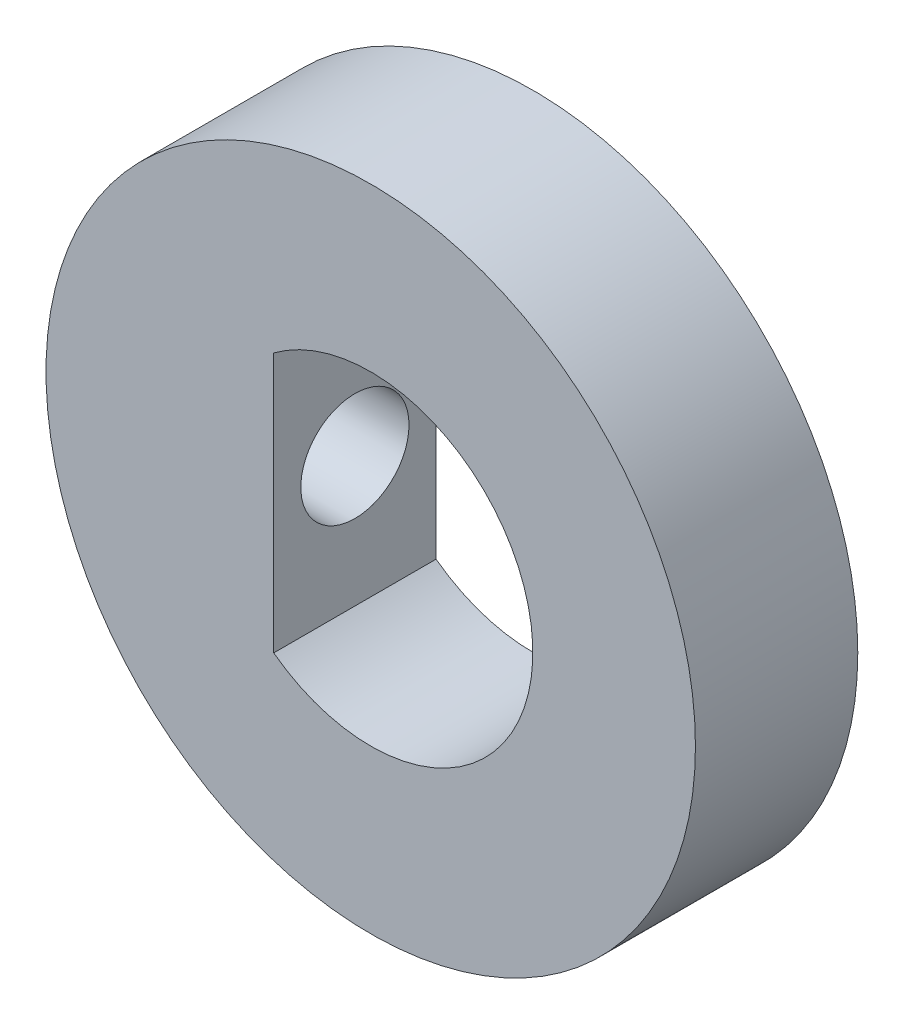
ISO-10303-21;
HEADER;
FILE_DESCRIPTION(('STEP AP214'),'2;1');
FILE_NAME('part.step','',(''),(''),'','','');
FILE_SCHEMA(('AUTOMOTIVE_DESIGN { 1 0 10303 214 1 1 1 1 }'));
ENDSEC;
DATA;
#1=APPLICATION_CONTEXT('core data for automotive mechanical design processes');
#2=APPLICATION_PROTOCOL_DEFINITION('international standard','automotive_design',2000,#1);
#3=PRODUCT_CONTEXT('',#1,'mechanical');
#4=PRODUCT('Part','Part','',(#3));
#5=PRODUCT_RELATED_PRODUCT_CATEGORY('part','',(#4));
#6=PRODUCT_DEFINITION_FORMATION('','',#4);
#7=PRODUCT_DEFINITION_CONTEXT('part definition',#1,'design');
#8=PRODUCT_DEFINITION('design','',#6,#7);
#9=PRODUCT_DEFINITION_SHAPE('','',#8);
#10=(LENGTH_UNIT() NAMED_UNIT(*) SI_UNIT(.MILLI.,.METRE.));
#11=(NAMED_UNIT(*) PLANE_ANGLE_UNIT() SI_UNIT($,.RADIAN.));
#12=(NAMED_UNIT(*) SI_UNIT($,.STERADIAN.) SOLID_ANGLE_UNIT());
#13=UNCERTAINTY_MEASURE_WITH_UNIT(LENGTH_MEASURE(1.E-05),#10,'distance_accuracy_value','');
#14=(GEOMETRIC_REPRESENTATION_CONTEXT(3) GLOBAL_UNCERTAINTY_ASSIGNED_CONTEXT((#13)) GLOBAL_UNIT_ASSIGNED_CONTEXT((#10,
#11,#12)) REPRESENTATION_CONTEXT('',''));
#15=CARTESIAN_POINT('',(0.,0.,0.));
#16=DIRECTION('',(0.,0.,1.));
#17=DIRECTION('',(1.,0.,0.));
#18=AXIS2_PLACEMENT_3D('',#15,#16,#17);
#19=CARTESIAN_POINT('',(0.,0.,3.));
#20=DIRECTION('',(0.,0.,-1.));
#21=DIRECTION('',(-1.,0.,0.));
#22=AXIS2_PLACEMENT_3D('',#19,#20,#21);
#23=CYLINDRICAL_SURFACE('',#22,2.99538411455495);
#24=CARTESIAN_POINT('',(0.,0.,0.));
#25=DIRECTION('',(0.,0.,1.));
#26=DIRECTION('',(1.,0.,0.));
#27=AXIS2_PLACEMENT_3D('',#24,#25,#26);
#28=CIRCLE('',#27,2.99538411455495);
#29=CARTESIAN_POINT('',(-1.79229629071985,-2.4,0.));
#30=VERTEX_POINT('',#29);
#31=CARTESIAN_POINT('',(-1.79229629071985,2.4,0.));
#32=VERTEX_POINT('',#31);
#33=EDGE_CURVE('E63',#30,#32,#28,.T.);
#34=ORIENTED_EDGE('',*,*,#33,.F.);
#35=DIRECTION('',(0.,0.,-1.));
#36=VECTOR('',#35,1.);
#37=CARTESIAN_POINT('',(-1.79229629071985,-2.4,3.));
#38=LINE('',#37,#36);
#39=CARTESIAN_POINT('',(-1.79229629071985,-2.4,3.));
#40=VERTEX_POINT('',#39);
#41=EDGE_CURVE('E11',#40,#30,#38,.T.);
#42=ORIENTED_EDGE('',*,*,#41,.F.);
#43=CARTESIAN_POINT('',(0.,0.,3.));
#44=DIRECTION('',(0.,0.,1.));
#45=DIRECTION('',(1.,0.,0.));
#46=AXIS2_PLACEMENT_3D('',#43,#44,#45);
#47=CIRCLE('',#46,2.99538411455495);
#48=CARTESIAN_POINT('',(-1.79229629071985,2.4,3.));
#49=VERTEX_POINT('',#48);
#50=EDGE_CURVE('E66',#40,#49,#47,.T.);
#51=ORIENTED_EDGE('',*,*,#50,.T.);
#52=DIRECTION('',(0.,0.,-1.));
#53=VECTOR('',#52,1.);
#54=CARTESIAN_POINT('',(-1.79229629071985,2.4,3.));
#55=LINE('',#54,#53);
#56=EDGE_CURVE('E48',#49,#32,#55,.T.);
#57=ORIENTED_EDGE('',*,*,#56,.T.);
#58=EDGE_LOOP('',(#34,#42,#51,#57));
#59=FACE_BOUND('',#58,.T.);
#60=ADVANCED_FACE('F35',(#59),#23,.F.);
#61=CARTESIAN_POINT('',(-1.79229629071985,0.,3.));
#62=DIRECTION('',(1.,0.,0.));
#63=DIRECTION('',(0.,0.,-1.));
#64=AXIS2_PLACEMENT_3D('',#61,#62,#63);
#65=PLANE('',#64);
#66=CARTESIAN_POINT('',(-1.79229629071985,0.,1.5));
#67=DIRECTION('',(1.,0.,0.));
#68=DIRECTION('',(0.,0.,-1.));
#69=AXIS2_PLACEMENT_3D('',#66,#67,#68);
#70=CIRCLE('',#69,1.);
#71=CARTESIAN_POINT('',(-1.79229629071985,0.,0.5));
#72=VERTEX_POINT('',#71);
#73=EDGE_CURVE('E86',#72,#72,#70,.T.);
#74=ORIENTED_EDGE('',*,*,#73,.F.);
#75=EDGE_LOOP('',(#74));
#76=FACE_BOUND('',#75,.T.);
#77=DIRECTION('',(0.,-1.,0.));
#78=VECTOR('',#77,1.);
#79=CARTESIAN_POINT('',(-1.79229629071985,0.,0.));
#80=LINE('',#79,#78);
#81=EDGE_CURVE('E73',#32,#30,#80,.T.);
#82=ORIENTED_EDGE('',*,*,#81,.F.);
#83=ORIENTED_EDGE('',*,*,#56,.F.);
#84=DIRECTION('',(0.,-1.,0.));
#85=VECTOR('',#84,1.);
#86=CARTESIAN_POINT('',(-1.79229629071985,0.,3.));
#87=LINE('',#86,#85);
#88=EDGE_CURVE('E83',#49,#40,#87,.T.);
#89=ORIENTED_EDGE('',*,*,#88,.T.);
#90=ORIENTED_EDGE('',*,*,#41,.T.);
#91=EDGE_LOOP('',(#82,#83,#89,#90));
#92=FACE_BOUND('',#91,.T.);
#93=ADVANCED_FACE('F75',(#76,#92),#65,.T.);
#94=CARTESIAN_POINT('',(0.,0.,3.));
#95=DIRECTION('',(0.,0.,-1.));
#96=DIRECTION('',(-1.,0.,0.));
#97=AXIS2_PLACEMENT_3D('',#94,#95,#96);
#98=CYLINDRICAL_SURFACE('',#97,6.);
#99=CARTESIAN_POINT('',(-6.,0.,2.5));
#100=CARTESIAN_POINT('',(-5.9999990446753,-0.0557563619832859,2.49999776442087));
#101=CARTESIAN_POINT('',(-5.99921471165214,-0.111543152735528,2.49532109001243));
#102=CARTESIAN_POINT('',(-5.99616137976555,-0.221552088669217,2.47674573649387));
#103=CARTESIAN_POINT('',(-5.99389101569556,-0.275772747183699,2.46283857723536));
#104=CARTESIAN_POINT('',(-5.9881202729458,-0.381041898885057,2.4262338205629));
#105=CARTESIAN_POINT('',(-5.98462090063677,-0.43209294737276,2.40354341374377));
#106=CARTESIAN_POINT('',(-5.97677690832828,-0.529656736791177,2.35003508317904));
#107=CARTESIAN_POINT('',(-5.97243238501774,-0.576169995951436,2.3192180890068));
#108=CARTESIAN_POINT('',(-5.96333326983325,-0.663789045716672,2.25001796647182));
#109=CARTESIAN_POINT('',(-5.95857548725943,-0.704845161413987,2.21157235414555));
#110=CARTESIAN_POINT('',(-5.94921050750693,-0.779955399463971,2.12834081261088));
#111=CARTESIAN_POINT('',(-5.94460331985067,-0.814009079756388,2.08355448341736));
#112=CARTESIAN_POINT('',(-5.93603026303912,-0.874346850242053,1.98857161352118));
#113=CARTESIAN_POINT('',(-5.93206851636655,-0.9005818211444,1.9383434652781));
#114=CARTESIAN_POINT('',(-5.9252791591787,-0.944223346164487,1.83411617427975));
#115=CARTESIAN_POINT('',(-5.92245147205723,-0.961630496626245,1.78011728652895));
#116=CARTESIAN_POINT('',(-5.91828214737102,-0.986965751113923,1.67040789005738));
#117=CARTESIAN_POINT('',(-5.9169270739428,-0.994979611654161,1.61471770539944));
#118=CARTESIAN_POINT('',(-5.9158157557466,-1.00156669011595,1.50276788924661));
#119=CARTESIAN_POINT('',(-5.91605939782886,-1.0001405761556,1.44650829833308));
#120=CARTESIAN_POINT('',(-5.91810571545422,-0.987958039358461,1.33562885548982));
#121=CARTESIAN_POINT('',(-5.91989229327567,-0.977297952755909,1.28099807858191));
#122=CARTESIAN_POINT('',(-5.92479798084403,-0.947101256161378,1.17431147286835));
#123=CARTESIAN_POINT('',(-5.92791713629309,-0.927564341727896,1.12225573244458));
#124=CARTESIAN_POINT('',(-5.9351539173364,-0.880070898437565,1.02190847062363));
#125=CARTESIAN_POINT('',(-5.9392762684293,-0.852074365551886,0.97363623756751));
#126=CARTESIAN_POINT('',(-5.94805167366004,-0.788484807022974,0.882438239784647));
#127=CARTESIAN_POINT('',(-5.95270477061715,-0.752891168261715,0.839512907018028));
#128=CARTESIAN_POINT('',(-5.96208811151914,-0.674592884863622,0.759669565677062));
#129=CARTESIAN_POINT('',(-5.96681859692661,-0.631805585549251,0.722832592583967));
#130=CARTESIAN_POINT('',(-5.97577040558689,-0.540614099592659,0.656848894933864));
#131=CARTESIAN_POINT('',(-5.97999172555898,-0.492209876762569,0.627702219926709));
#132=CARTESIAN_POINT('',(-5.98745557157165,-0.391082366466685,0.577919109145487));
#133=CARTESIAN_POINT('',(-5.99069727362979,-0.338355490225865,0.557289832267498));
#134=CARTESIAN_POINT('',(-5.99583001205064,-0.230119338241093,0.525202313901609));
#135=CARTESIAN_POINT('',(-5.9977211614019,-0.174610295671788,0.513743305210513));
#136=CARTESIAN_POINT('',(-5.99992451937074,-0.06308396052065,0.500431456615546));
#137=CARTESIAN_POINT('',(-6.00025501205114,-0.00708029486040509,0.498467371277757));
#138=CARTESIAN_POINT('',(-5.99934989768468,0.104455909155954,0.503904537771249));
#139=CARTESIAN_POINT('',(-5.99811435089647,0.159988465556815,0.511305429253494));
#140=CARTESIAN_POINT('',(-5.99422730775281,0.268662470218705,0.535169939734191));
#141=CARTESIAN_POINT('',(-5.99158441920524,0.321816347354151,0.55157848335605));
#142=CARTESIAN_POINT('',(-5.98517785782144,0.424618753944177,0.592933807279813));
#143=CARTESIAN_POINT('',(-5.98141412204808,0.474267086363887,0.617881067054109));
#144=CARTESIAN_POINT('',(-5.97313806520963,0.569132275787583,0.675860449878715));
#145=CARTESIAN_POINT('',(-5.96861942354809,0.614306100374859,0.708962062466901));
#146=CARTESIAN_POINT('',(-5.9593538695676,0.698497434201075,0.782214926154024));
#147=CARTESIAN_POINT('',(-5.95460694068619,0.737514495878633,0.822366689310667));
#148=CARTESIAN_POINT('',(-5.94536070094338,0.8086971118632,0.909079019228569));
#149=CARTESIAN_POINT('',(-5.94086446454842,0.840787504445486,0.955701666205764));
#150=CARTESIAN_POINT('',(-5.93268611911154,0.896680924117994,1.05374118765542));
#151=CARTESIAN_POINT('',(-5.92900398426408,0.920484213907929,1.105157910091));
#152=CARTESIAN_POINT('',(-5.92289381479082,0.959015332589259,1.21111589312485));
#153=CARTESIAN_POINT('',(-5.92046061724426,0.973780573019178,1.2656432380122));
#154=CARTESIAN_POINT('',(-5.91711086734104,0.993934181511311,1.3764480516887));
#155=CARTESIAN_POINT('',(-5.91619418313089,0.999323364778467,1.43272536789282));
#156=CARTESIAN_POINT('',(-5.91598693233605,1.00054914641894,1.54468206638496));
#157=CARTESIAN_POINT('',(-5.9166762260226,0.996504054450075,1.60036015143012));
#158=CARTESIAN_POINT('',(-5.91955912581491,0.979231935582739,1.71023169922031));
#159=CARTESIAN_POINT('',(-5.92175272704486,0.966004938444991,1.76442516677675));
#160=CARTESIAN_POINT('',(-5.92738942512688,0.930789795837961,1.86974337491705));
#161=CARTESIAN_POINT('',(-5.93083106887868,0.908811836240177,1.92087160402241));
#162=CARTESIAN_POINT('',(-5.93857747568883,0.856730801566364,2.01873426767794));
#163=CARTESIAN_POINT('',(-5.9428822815536,0.826627323499425,2.06546848414885));
#164=CARTESIAN_POINT('',(-5.95193381618249,0.758727553748862,2.1538142332431));
#165=CARTESIAN_POINT('',(-5.95668518230521,0.720844225437459,2.19535840668011));
#166=CARTESIAN_POINT('',(-5.96605748944336,0.638643612552092,2.27154064178997));
#167=CARTESIAN_POINT('',(-5.97067840010619,0.594324845165055,2.30617710745527));
#168=CARTESIAN_POINT('',(-5.97930611856888,0.500147667856113,2.36777930727998));
#169=CARTESIAN_POINT('',(-5.98330846501242,0.450253115013128,2.39469041572518));
#170=CARTESIAN_POINT('',(-5.9902046704071,0.346605227751593,2.43970779384397));
#171=CARTESIAN_POINT('',(-5.99309963270993,0.292855797932004,2.45782283243188));
#172=CARTESIAN_POINT('',(-5.99682316333182,0.199081324018161,2.48080210965067));
#173=CARTESIAN_POINT('',(-5.99800810909344,0.159623532119379,2.48798978784639));
#174=CARTESIAN_POINT('',(-5.99959686394448,0.0801157241279235,2.4975894951379));
#175=CARTESIAN_POINT('',(-6.00000068648257,0.0400657182433976,2.50000160645494));
#176=CARTESIAN_POINT('',(-6.,0.,2.5));
#177=B_SPLINE_CURVE_WITH_KNOTS('',3,(#99,#100,#101,#102,#103,#104,#105,#106,#107,#108,#109,#110,
#111,#112,#113,#114,#115,#116,#117,#118,#119,#120,#121,#122,#123,#124,#125,#126,#127,#128,#129,
#130,#131,#132,#133,#134,#135,#136,#137,#138,#139,#140,#141,#142,#143,#144,#145,#146,#147,#148,
#149,#150,#151,#152,#153,#154,#155,#156,#157,#158,#159,#160,#161,#162,#163,#164,#165,#166,#167,
#168,#169,#170,#171,#172,#173,#174,#175,#176),.UNSPECIFIED.,.T.,.F.,(4,2,2,2,2,2,2,2,2,2,2,2,2,
2,2,2,2,2,2,2,2,2,2,2,2,2,2,2,2,2,2,2,2,2,2,2,2,2,4),(0.,0.167122633975404,0.334399018278168,
0.501538746810108,0.668659365069916,0.837209964249328,1.00577120067943,1.17537008329536,
1.34495750750472,1.51298430841369,1.68099921728355,1.84728208704163,2.01357066010152,
2.18065822653023,2.34775928272229,2.51693107964531,2.68610396654339,2.85541875566361,
3.02471937808459,3.19203153396559,3.35933725214344,3.52563122802566,3.69193454330426,
3.85970730250809,4.02749225221713,4.19701528803048,4.36653294950377,4.53534408936709,
4.70414055114647,4.8708316380908,5.03752218475253,5.20401927290489,5.37052462011734,
5.53900553677357,5.70752533551589,5.8772089264288,6.04672300852029,6.16681699265607,
6.28690890910787),.UNSPECIFIED.);
#178=CARTESIAN_POINT('',(-6.,0.,2.5));
#179=VERTEX_POINT('',#178);
#180=EDGE_CURVE('E38',#179,#179,#177,.T.);
#181=ORIENTED_EDGE('',*,*,#180,.T.);
#182=EDGE_LOOP('',(#181));
#183=FACE_BOUND('',#182,.T.);
#184=CARTESIAN_POINT('',(0.,0.,3.));
#185=DIRECTION('',(0.,0.,1.));
#186=DIRECTION('',(1.,0.,0.));
#187=AXIS2_PLACEMENT_3D('',#184,#185,#186);
#188=CIRCLE('',#187,6.);
#189=CARTESIAN_POINT('',(6.,0.,3.));
#190=VERTEX_POINT('',#189);
#191=EDGE_CURVE('E68',#190,#190,#188,.T.);
#192=ORIENTED_EDGE('',*,*,#191,.F.);
#193=EDGE_LOOP('',(#192));
#194=FACE_BOUND('',#193,.T.);
#195=CARTESIAN_POINT('',(0.,0.,0.));
#196=DIRECTION('',(0.,0.,1.));
#197=DIRECTION('',(1.,0.,0.));
#198=AXIS2_PLACEMENT_3D('',#195,#196,#197);
#199=CIRCLE('',#198,6.);
#200=CARTESIAN_POINT('',(6.,0.,0.));
#201=VERTEX_POINT('',#200);
#202=EDGE_CURVE('E76',#201,#201,#199,.T.);
#203=ORIENTED_EDGE('',*,*,#202,.T.);
#204=EDGE_LOOP('',(#203));
#205=FACE_BOUND('',#204,.T.);
#206=ADVANCED_FACE('F93',(#183,#194,#205),#98,.T.);
#207=CARTESIAN_POINT('',(0.,0.,3.));
#208=DIRECTION('',(0.,0.,1.));
#209=DIRECTION('',(1.,0.,0.));
#210=AXIS2_PLACEMENT_3D('',#207,#208,#209);
#211=PLANE('',#210);
#212=ORIENTED_EDGE('',*,*,#50,.F.);
#213=ORIENTED_EDGE('',*,*,#88,.F.);
#214=EDGE_LOOP('',(#212,#213));
#215=FACE_BOUND('',#214,.T.);
#216=ORIENTED_EDGE('',*,*,#191,.T.);
#217=EDGE_LOOP('',(#216));
#218=FACE_BOUND('',#217,.T.);
#219=ADVANCED_FACE('F101',(#215,#218),#211,.T.);
#220=CARTESIAN_POINT('',(0.,0.,0.));
#221=DIRECTION('',(0.,0.,1.));
#222=DIRECTION('',(1.,0.,0.));
#223=AXIS2_PLACEMENT_3D('',#220,#221,#222);
#224=PLANE('',#223);
#225=ORIENTED_EDGE('',*,*,#33,.T.);
#226=ORIENTED_EDGE('',*,*,#81,.T.);
#227=EDGE_LOOP('',(#225,#226));
#228=FACE_BOUND('',#227,.T.);
#229=ORIENTED_EDGE('',*,*,#202,.F.);
#230=EDGE_LOOP('',(#229));
#231=FACE_BOUND('',#230,.T.);
#232=ADVANCED_FACE('F71',(#228,#231),#224,.F.);
#233=CARTESIAN_POINT('',(-11.7922962907198,0.,1.5));
#234=DIRECTION('',(1.,0.,0.));
#235=DIRECTION('',(0.,0.,-1.));
#236=AXIS2_PLACEMENT_3D('',#233,#234,#235);
#237=CYLINDRICAL_SURFACE('',#236,1.);
#238=ORIENTED_EDGE('',*,*,#73,.T.);
#239=EDGE_LOOP('',(#238));
#240=FACE_BOUND('',#239,.T.);
#241=ORIENTED_EDGE('',*,*,#180,.F.);
#242=EDGE_LOOP('',(#241));
#243=FACE_BOUND('',#242,.T.);
#244=ADVANCED_FACE('F96',(#240,#243),#237,.F.);
#245=CLOSED_SHELL('',(#60,#93,#206,#219,#232,#244));
#246=MANIFOLD_SOLID_BREP('B2',#245);
#247=ADVANCED_BREP_SHAPE_REPRESENTATION('',(#18,#246),#14);
#248=SHAPE_DEFINITION_REPRESENTATION(#9,#247);
ENDSEC;
END-ISO-10303-21;
